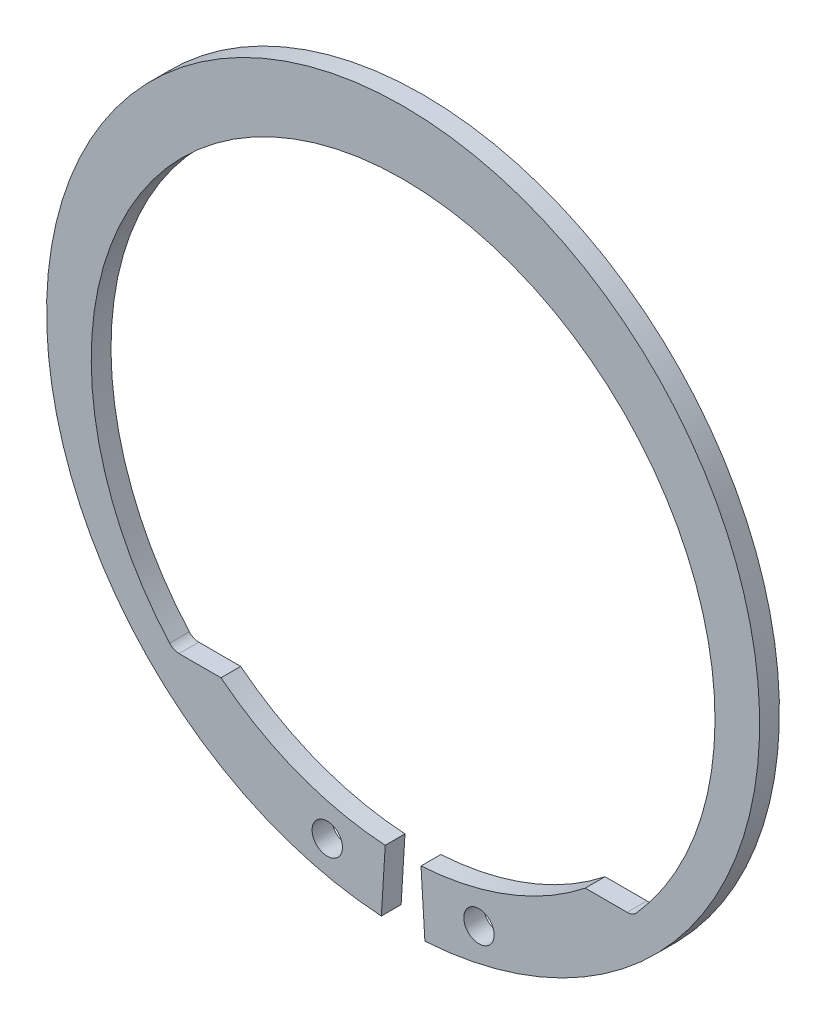
ISO-10303-21;
HEADER;
FILE_DESCRIPTION(('STEP AP214'),'2;1');
FILE_NAME('part.step','',(''),(''),'','','');
FILE_SCHEMA(('AUTOMOTIVE_DESIGN { 1 0 10303 214 1 1 1 1 }'));
ENDSEC;
DATA;
#1=APPLICATION_CONTEXT('core data for automotive mechanical design processes');
#2=APPLICATION_PROTOCOL_DEFINITION('international standard','automotive_design',2000,#1);
#3=PRODUCT_CONTEXT('',#1,'mechanical');
#4=PRODUCT('Part','Part','',(#3));
#5=PRODUCT_RELATED_PRODUCT_CATEGORY('part','',(#4));
#6=PRODUCT_DEFINITION_FORMATION('','',#4);
#7=PRODUCT_DEFINITION_CONTEXT('part definition',#1,'design');
#8=PRODUCT_DEFINITION('design','',#6,#7);
#9=PRODUCT_DEFINITION_SHAPE('','',#8);
#10=(LENGTH_UNIT() NAMED_UNIT(*) SI_UNIT(.MILLI.,.METRE.));
#11=(NAMED_UNIT(*) PLANE_ANGLE_UNIT() SI_UNIT($,.RADIAN.));
#12=(NAMED_UNIT(*) SI_UNIT($,.STERADIAN.) SOLID_ANGLE_UNIT());
#13=UNCERTAINTY_MEASURE_WITH_UNIT(LENGTH_MEASURE(1.E-05),#10,'distance_accuracy_value','');
#14=(GEOMETRIC_REPRESENTATION_CONTEXT(3) GLOBAL_UNCERTAINTY_ASSIGNED_CONTEXT((#13)) GLOBAL_UNIT_ASSIGNED_CONTEXT((#10,
#11,#12)) REPRESENTATION_CONTEXT('',''));
#15=CARTESIAN_POINT('',(0.,0.,0.));
#16=DIRECTION('',(0.,0.,1.));
#17=DIRECTION('',(1.,0.,0.));
#18=AXIS2_PLACEMENT_3D('',#15,#16,#17);
#19=CARTESIAN_POINT('',(0.,0.,0.9906));
#20=DIRECTION('',(0.,0.,1.));
#21=DIRECTION('',(1.,0.,0.));
#22=AXIS2_PLACEMENT_3D('',#19,#20,#21);
#23=PLANE('',#22);
#24=CARTESIAN_POINT('',(0.,0.,0.9906));
#25=DIRECTION('',(0.,0.,-1.));
#26=DIRECTION('',(1.,0.,0.));
#27=AXIS2_PLACEMENT_3D('',#24,#25,#26);
#28=CIRCLE('',#27,29.3751);
#29=CARTESIAN_POINT('',(-1.79330695369038,-29.3203095171222,0.9906));
#30=VERTEX_POINT('',#29);
#31=CARTESIAN_POINT('',(-18.2521778154004,-23.0163964383004,0.9906));
#32=VERTEX_POINT('',#31);
#33=EDGE_CURVE('E168',#30,#32,#28,.T.);
#34=ORIENTED_EDGE('',*,*,#33,.T.);
#35=DIRECTION('',(-1.,0.,0.));
#36=VECTOR('',#35,1.);
#37=CARTESIAN_POINT('',(-18.2521778154004,-23.0163964383004,0.9906));
#38=LINE('',#37,#36);
#39=CARTESIAN_POINT('',(-22.4515344099216,-23.0163964383004,0.9906));
#40=VERTEX_POINT('',#39);
#41=EDGE_CURVE('E170',#32,#40,#38,.T.);
#42=ORIENTED_EDGE('',*,*,#41,.T.);
#43=CARTESIAN_POINT('',(-22.4515344099216,-21.7463964383004,0.9906));
#44=DIRECTION('',(0.,0.,1.));
#45=DIRECTION('',(1.,0.,0.));
#46=AXIS2_PLACEMENT_3D('',#43,#44,#45);
#47=CIRCLE('',#46,1.27);
#48=CARTESIAN_POINT('',(-23.4025698669964,-22.5880802027788,0.9906));
#49=VERTEX_POINT('',#48);
#50=EDGE_CURVE('E11',#40,#49,#47,.F.);
#51=ORIENTED_EDGE('',*,*,#50,.T.);
#52=CARTESIAN_POINT('',(0.,-1.87637807054762,0.9906));
#53=DIRECTION('',(0.,0.,-1.));
#54=DIRECTION('',(-1.,0.,0.));
#55=AXIS2_PLACEMENT_3D('',#52,#53,#54);
#56=CIRCLE('',#55,31.2514780705476);
#57=CARTESIAN_POINT('',(23.4025698669964,-22.5880802027788,0.9906));
#58=VERTEX_POINT('',#57);
#59=EDGE_CURVE('E173',#49,#58,#56,.T.);
#60=ORIENTED_EDGE('',*,*,#59,.T.);
#61=CARTESIAN_POINT('',(22.4515344099216,-21.7463964383004,0.9906));
#62=DIRECTION('',(0.,0.,-1.));
#63=DIRECTION('',(-1.,0.,0.));
#64=AXIS2_PLACEMENT_3D('',#61,#62,#63);
#65=CIRCLE('',#64,1.27);
#66=CARTESIAN_POINT('',(22.4515344099216,-23.0163964383004,0.9906));
#67=VERTEX_POINT('',#66);
#68=EDGE_CURVE('E131',#67,#58,#65,.F.);
#69=ORIENTED_EDGE('',*,*,#68,.F.);
#70=DIRECTION('',(1.,0.,0.));
#71=VECTOR('',#70,1.);
#72=CARTESIAN_POINT('',(18.2521778154004,-23.0163964383004,0.9906));
#73=LINE('',#72,#71);
#74=CARTESIAN_POINT('',(18.2521778154004,-23.0163964383004,0.9906));
#75=VERTEX_POINT('',#74);
#76=EDGE_CURVE('E113',#75,#67,#73,.T.);
#77=ORIENTED_EDGE('',*,*,#76,.F.);
#78=CARTESIAN_POINT('',(0.,0.,0.9906));
#79=DIRECTION('',(0.,0.,1.));
#80=DIRECTION('',(-1.,0.,0.));
#81=AXIS2_PLACEMENT_3D('',#78,#79,#80);
#82=CIRCLE('',#81,29.3751);
#83=CARTESIAN_POINT('',(1.79330695369038,-29.3203095171222,0.9906));
#84=VERTEX_POINT('',#83);
#85=EDGE_CURVE('E129',#84,#75,#82,.T.);
#86=ORIENTED_EDGE('',*,*,#85,.F.);
#87=DIRECTION('',(-0.061048539534857,0.998134798421867,0.));
#88=VECTOR('',#87,1.);
#89=CARTESIAN_POINT('',(1.79330695369038,-29.3203095171222,0.9906));
#90=LINE('',#89,#88);
#91=CARTESIAN_POINT('',(2.18096517973671,-35.6584654871011,0.9906));
#92=VERTEX_POINT('',#91);
#93=EDGE_CURVE('E132',#92,#84,#90,.T.);
#94=ORIENTED_EDGE('',*,*,#93,.F.);
#95=CARTESIAN_POINT('',(0.,0.,0.9906));
#96=DIRECTION('',(0.,0.,1.));
#97=DIRECTION('',(1.,0.,0.));
#98=AXIS2_PLACEMENT_3D('',#95,#96,#97);
#99=CIRCLE('',#98,35.7251);
#100=CARTESIAN_POINT('',(-2.18096517973671,-35.6584654871011,0.9906));
#101=VERTEX_POINT('',#100);
#102=EDGE_CURVE('E175',#92,#101,#99,.T.);
#103=ORIENTED_EDGE('',*,*,#102,.T.);
#104=DIRECTION('',(0.061048539534857,0.998134798421867,0.));
#105=VECTOR('',#104,1.);
#106=CARTESIAN_POINT('',(-1.79330695369038,-29.3203095171222,0.9906));
#107=LINE('',#106,#105);
#108=EDGE_CURVE('E177',#101,#30,#107,.T.);
#109=ORIENTED_EDGE('',*,*,#108,.T.);
#110=EDGE_LOOP('',(#34,#42,#51,#60,#69,#77,#86,#94,#103,#109));
#111=FACE_BOUND('',#110,.T.);
#112=CARTESIAN_POINT('',(-7.59866993804612,-31.6507381459364,0.9906));
#113=DIRECTION('',(0.,0.,1.));
#114=DIRECTION('',(1.,0.,0.));
#115=AXIS2_PLACEMENT_3D('',#112,#113,#114);
#116=CIRCLE('',#115,1.524);
#117=CARTESIAN_POINT('',(-6.07466993804612,-31.6507381459364,0.9906));
#118=VERTEX_POINT('',#117);
#119=EDGE_CURVE('E162',#118,#118,#116,.T.);
#120=ORIENTED_EDGE('',*,*,#119,.F.);
#121=EDGE_LOOP('',(#120));
#122=FACE_BOUND('',#121,.T.);
#123=CARTESIAN_POINT('',(7.59866993804612,-31.6507381459364,0.9906));
#124=DIRECTION('',(0.,0.,-1.));
#125=DIRECTION('',(-1.,0.,0.));
#126=AXIS2_PLACEMENT_3D('',#123,#124,#125);
#127=CIRCLE('',#126,1.524);
#128=CARTESIAN_POINT('',(6.07466993804612,-31.6507381459364,0.9906));
#129=VERTEX_POINT('',#128);
#130=EDGE_CURVE('E148',#129,#129,#127,.T.);
#131=ORIENTED_EDGE('',*,*,#130,.T.);
#132=EDGE_LOOP('',(#131));
#133=FACE_BOUND('',#132,.T.);
#134=ADVANCED_FACE('F35',(#111,#122,#133),#23,.T.);
#135=CARTESIAN_POINT('',(0.,0.,-0.9906));
#136=DIRECTION('',(0.,0.,1.));
#137=DIRECTION('',(1.,0.,0.));
#138=AXIS2_PLACEMENT_3D('',#135,#136,#137);
#139=PLANE('',#138);
#140=CARTESIAN_POINT('',(0.,0.,-0.9906));
#141=DIRECTION('',(0.,0.,-1.));
#142=DIRECTION('',(1.,0.,0.));
#143=AXIS2_PLACEMENT_3D('',#140,#141,#142);
#144=CIRCLE('',#143,29.3751);
#145=CARTESIAN_POINT('',(-1.79330695369038,-29.3203095171222,-0.9906));
#146=VERTEX_POINT('',#145);
#147=CARTESIAN_POINT('',(-18.2521778154004,-23.0163964383004,-0.9906));
#148=VERTEX_POINT('',#147);
#149=EDGE_CURVE('E165',#146,#148,#144,.T.);
#150=ORIENTED_EDGE('',*,*,#149,.F.);
#151=DIRECTION('',(0.061048539534857,0.998134798421867,0.));
#152=VECTOR('',#151,1.);
#153=CARTESIAN_POINT('',(-1.79330695369038,-29.3203095171222,-0.9906));
#154=LINE('',#153,#152);
#155=CARTESIAN_POINT('',(-2.18096517973671,-35.6584654871011,-0.9906));
#156=VERTEX_POINT('',#155);
#157=EDGE_CURVE('E171',#156,#146,#154,.T.);
#158=ORIENTED_EDGE('',*,*,#157,.F.);
#159=CARTESIAN_POINT('',(0.,0.,-0.9906));
#160=DIRECTION('',(0.,0.,1.));
#161=DIRECTION('',(1.,0.,0.));
#162=AXIS2_PLACEMENT_3D('',#159,#160,#161);
#163=CIRCLE('',#162,35.7251);
#164=CARTESIAN_POINT('',(2.18096517973671,-35.6584654871011,-0.9906));
#165=VERTEX_POINT('',#164);
#166=EDGE_CURVE('E186',#165,#156,#163,.T.);
#167=ORIENTED_EDGE('',*,*,#166,.F.);
#168=DIRECTION('',(-0.061048539534857,0.998134798421867,0.));
#169=VECTOR('',#168,1.);
#170=CARTESIAN_POINT('',(1.79330695369038,-29.3203095171222,-0.9906));
#171=LINE('',#170,#169);
#172=CARTESIAN_POINT('',(1.79330695369038,-29.3203095171222,-0.9906));
#173=VERTEX_POINT('',#172);
#174=EDGE_CURVE('E137',#165,#173,#171,.T.);
#175=ORIENTED_EDGE('',*,*,#174,.T.);
#176=CARTESIAN_POINT('',(0.,0.,-0.9906));
#177=DIRECTION('',(0.,0.,1.));
#178=DIRECTION('',(-1.,0.,0.));
#179=AXIS2_PLACEMENT_3D('',#176,#177,#178);
#180=CIRCLE('',#179,29.3751);
#181=CARTESIAN_POINT('',(18.2521778154004,-23.0163964383004,-0.9906));
#182=VERTEX_POINT('',#181);
#183=EDGE_CURVE('E146',#173,#182,#180,.T.);
#184=ORIENTED_EDGE('',*,*,#183,.T.);
#185=DIRECTION('',(1.,0.,0.));
#186=VECTOR('',#185,1.);
#187=CARTESIAN_POINT('',(18.2521778154004,-23.0163964383004,-0.9906));
#188=LINE('',#187,#186);
#189=CARTESIAN_POINT('',(22.4515344099216,-23.0163964383004,-0.9906));
#190=VERTEX_POINT('',#189);
#191=EDGE_CURVE('E116',#182,#190,#188,.T.);
#192=ORIENTED_EDGE('',*,*,#191,.T.);
#193=CARTESIAN_POINT('',(22.4515344099216,-21.7463964383004,-0.9906));
#194=DIRECTION('',(0.,0.,-1.));
#195=DIRECTION('',(-1.,0.,0.));
#196=AXIS2_PLACEMENT_3D('',#193,#194,#195);
#197=CIRCLE('',#196,1.27);
#198=CARTESIAN_POINT('',(23.4025698669964,-22.5880802027788,-0.9906));
#199=VERTEX_POINT('',#198);
#200=EDGE_CURVE('E157',#199,#190,#197,.T.);
#201=ORIENTED_EDGE('',*,*,#200,.F.);
#202=CARTESIAN_POINT('',(0.,-1.87637807054762,-0.9906));
#203=DIRECTION('',(0.,0.,-1.));
#204=DIRECTION('',(-1.,0.,0.));
#205=AXIS2_PLACEMENT_3D('',#202,#203,#204);
#206=CIRCLE('',#205,31.2514780705476);
#207=CARTESIAN_POINT('',(-23.4025698669964,-22.5880802027788,-0.9906));
#208=VERTEX_POINT('',#207);
#209=EDGE_CURVE('E184',#208,#199,#206,.T.);
#210=ORIENTED_EDGE('',*,*,#209,.F.);
#211=CARTESIAN_POINT('',(-22.4515344099216,-21.7463964383004,-0.9906));
#212=DIRECTION('',(0.,0.,1.));
#213=DIRECTION('',(1.,0.,0.));
#214=AXIS2_PLACEMENT_3D('',#211,#212,#213);
#215=CIRCLE('',#214,1.27);
#216=CARTESIAN_POINT('',(-22.4515344099216,-23.0163964383004,-0.9906));
#217=VERTEX_POINT('',#216);
#218=EDGE_CURVE('E43',#208,#217,#215,.T.);
#219=ORIENTED_EDGE('',*,*,#218,.T.);
#220=DIRECTION('',(-1.,0.,0.));
#221=VECTOR('',#220,1.);
#222=CARTESIAN_POINT('',(-18.2521778154004,-23.0163964383004,-0.9906));
#223=LINE('',#222,#221);
#224=EDGE_CURVE('E182',#148,#217,#223,.T.);
#225=ORIENTED_EDGE('',*,*,#224,.F.);
#226=EDGE_LOOP('',(#150,#158,#167,#175,#184,#192,#201,#210,#219,#225));
#227=FACE_BOUND('',#226,.T.);
#228=CARTESIAN_POINT('',(-7.59866993804612,-31.6507381459364,-0.9906));
#229=DIRECTION('',(0.,0.,1.));
#230=DIRECTION('',(1.,0.,0.));
#231=AXIS2_PLACEMENT_3D('',#228,#229,#230);
#232=CIRCLE('',#231,1.524);
#233=CARTESIAN_POINT('',(-6.07466993804612,-31.6507381459364,-0.9906));
#234=VERTEX_POINT('',#233);
#235=EDGE_CURVE('E161',#234,#234,#232,.T.);
#236=ORIENTED_EDGE('',*,*,#235,.T.);
#237=EDGE_LOOP('',(#236));
#238=FACE_BOUND('',#237,.T.);
#239=CARTESIAN_POINT('',(7.59866993804612,-31.6507381459364,-0.9906));
#240=DIRECTION('',(0.,0.,-1.));
#241=DIRECTION('',(-1.,0.,0.));
#242=AXIS2_PLACEMENT_3D('',#239,#240,#241);
#243=CIRCLE('',#242,1.524);
#244=CARTESIAN_POINT('',(6.07466993804612,-31.6507381459364,-0.9906));
#245=VERTEX_POINT('',#244);
#246=EDGE_CURVE('E142',#245,#245,#243,.T.);
#247=ORIENTED_EDGE('',*,*,#246,.F.);
#248=EDGE_LOOP('',(#247));
#249=FACE_BOUND('',#248,.T.);
#250=ADVANCED_FACE('F209',(#227,#238,#249),#139,.F.);
#251=CARTESIAN_POINT('',(0.,0.,0.9906));
#252=DIRECTION('',(0.,0.,-1.));
#253=DIRECTION('',(-1.,0.,0.));
#254=AXIS2_PLACEMENT_3D('',#251,#252,#253);
#255=CYLINDRICAL_SURFACE('',#254,29.3751);
#256=ORIENTED_EDGE('',*,*,#149,.T.);
#257=DIRECTION('',(0.,0.,-1.));
#258=VECTOR('',#257,1.);
#259=CARTESIAN_POINT('',(-18.2521778154004,-23.0163964383004,0.9906));
#260=LINE('',#259,#258);
#261=EDGE_CURVE('E194',#32,#148,#260,.T.);
#262=ORIENTED_EDGE('',*,*,#261,.F.);
#263=ORIENTED_EDGE('',*,*,#33,.F.);
#264=DIRECTION('',(0.,0.,-1.));
#265=VECTOR('',#264,1.);
#266=CARTESIAN_POINT('',(-1.79330695369038,-29.3203095171222,0.9906));
#267=LINE('',#266,#265);
#268=EDGE_CURVE('E179',#30,#146,#267,.T.);
#269=ORIENTED_EDGE('',*,*,#268,.T.);
#270=EDGE_LOOP('',(#256,#262,#263,#269));
#271=FACE_BOUND('',#270,.T.);
#272=ADVANCED_FACE('F229',(#271),#255,.F.);
#273=CARTESIAN_POINT('',(-18.2521778154004,-23.0163964383004,0.9906));
#274=DIRECTION('',(0.,-1.,0.));
#275=DIRECTION('',(0.,0.,-1.));
#276=AXIS2_PLACEMENT_3D('',#273,#274,#275);
#277=PLANE('',#276);
#278=ORIENTED_EDGE('',*,*,#224,.T.);
#279=DIRECTION('',(0.,0.,1.));
#280=VECTOR('',#279,1.);
#281=CARTESIAN_POINT('',(-22.4515344099216,-23.0163964383004,0.9906));
#282=LINE('',#281,#280);
#283=EDGE_CURVE('E50',#217,#40,#282,.T.);
#284=ORIENTED_EDGE('',*,*,#283,.T.);
#285=ORIENTED_EDGE('',*,*,#41,.F.);
#286=ORIENTED_EDGE('',*,*,#261,.T.);
#287=EDGE_LOOP('',(#278,#284,#285,#286));
#288=FACE_BOUND('',#287,.T.);
#289=ADVANCED_FACE('F243',(#288),#277,.F.);
#290=CARTESIAN_POINT('',(0.,-1.87637807054762,0.9906));
#291=DIRECTION('',(0.,0.,-1.));
#292=DIRECTION('',(-1.,0.,0.));
#293=AXIS2_PLACEMENT_3D('',#290,#291,#292);
#294=CYLINDRICAL_SURFACE('',#293,31.2514780705476);
#295=ORIENTED_EDGE('',*,*,#59,.F.);
#296=DIRECTION('',(0.,0.,-1.));
#297=VECTOR('',#296,1.);
#298=CARTESIAN_POINT('',(-23.4025698669964,-22.5880802027788,0.9906));
#299=LINE('',#298,#297);
#300=EDGE_CURVE('E197',#49,#208,#299,.T.);
#301=ORIENTED_EDGE('',*,*,#300,.T.);
#302=ORIENTED_EDGE('',*,*,#209,.T.);
#303=DIRECTION('',(0.,0.,-1.));
#304=VECTOR('',#303,1.);
#305=CARTESIAN_POINT('',(23.4025698669964,-22.5880802027788,0.9906));
#306=LINE('',#305,#304);
#307=EDGE_CURVE('E121',#58,#199,#306,.T.);
#308=ORIENTED_EDGE('',*,*,#307,.F.);
#309=EDGE_LOOP('',(#295,#301,#302,#308));
#310=FACE_BOUND('',#309,.T.);
#311=ADVANCED_FACE('F203',(#310),#294,.F.);
#312=CARTESIAN_POINT('',(0.,0.,0.9906));
#313=DIRECTION('',(0.,0.,-1.));
#314=DIRECTION('',(-1.,0.,0.));
#315=AXIS2_PLACEMENT_3D('',#312,#313,#314);
#316=CYLINDRICAL_SURFACE('',#315,35.7251);
#317=ORIENTED_EDGE('',*,*,#166,.T.);
#318=DIRECTION('',(0.,0.,-1.));
#319=VECTOR('',#318,1.);
#320=CARTESIAN_POINT('',(-2.18096517973671,-35.6584654871011,0.9906));
#321=LINE('',#320,#319);
#322=EDGE_CURVE('E191',#101,#156,#321,.T.);
#323=ORIENTED_EDGE('',*,*,#322,.F.);
#324=ORIENTED_EDGE('',*,*,#102,.F.);
#325=DIRECTION('',(0.,0.,-1.));
#326=VECTOR('',#325,1.);
#327=CARTESIAN_POINT('',(2.18096517973671,-35.6584654871011,0.9906));
#328=LINE('',#327,#326);
#329=EDGE_CURVE('E122',#92,#165,#328,.T.);
#330=ORIENTED_EDGE('',*,*,#329,.T.);
#331=EDGE_LOOP('',(#317,#323,#324,#330));
#332=FACE_BOUND('',#331,.T.);
#333=ADVANCED_FACE('F236',(#332),#316,.T.);
#334=CARTESIAN_POINT('',(-1.79330695369038,-29.3203095171222,0.9906));
#335=DIRECTION('',(-0.998134798421867,0.061048539534857,0.));
#336=DIRECTION('',(-0.061048539534857,-0.998134798421867,0.));
#337=AXIS2_PLACEMENT_3D('',#334,#335,#336);
#338=PLANE('',#337);
#339=ORIENTED_EDGE('',*,*,#157,.T.);
#340=ORIENTED_EDGE('',*,*,#268,.F.);
#341=ORIENTED_EDGE('',*,*,#108,.F.);
#342=ORIENTED_EDGE('',*,*,#322,.T.);
#343=EDGE_LOOP('',(#339,#340,#341,#342));
#344=FACE_BOUND('',#343,.T.);
#345=ADVANCED_FACE('F233',(#344),#338,.F.);
#346=CARTESIAN_POINT('',(-7.59866993804612,-31.6507381459364,0.9906));
#347=DIRECTION('',(0.,0.,-1.));
#348=DIRECTION('',(-1.,0.,0.));
#349=AXIS2_PLACEMENT_3D('',#346,#347,#348);
#350=CYLINDRICAL_SURFACE('',#349,1.524);
#351=ORIENTED_EDGE('',*,*,#119,.T.);
#352=EDGE_LOOP('',(#351));
#353=FACE_BOUND('',#352,.T.);
#354=ORIENTED_EDGE('',*,*,#235,.F.);
#355=EDGE_LOOP('',(#354));
#356=FACE_BOUND('',#355,.T.);
#357=ADVANCED_FACE('F231',(#353,#356),#350,.F.);
#358=CARTESIAN_POINT('',(-22.4515344099216,-21.7463964383004,0.9906));
#359=DIRECTION('',(0.,0.,-1.));
#360=DIRECTION('',(-1.,0.,0.));
#361=AXIS2_PLACEMENT_3D('',#358,#359,#360);
#362=CYLINDRICAL_SURFACE('',#361,1.27);
#363=ORIENTED_EDGE('',*,*,#50,.F.);
#364=ORIENTED_EDGE('',*,*,#283,.F.);
#365=ORIENTED_EDGE('',*,*,#218,.F.);
#366=ORIENTED_EDGE('',*,*,#300,.F.);
#367=EDGE_LOOP('',(#363,#364,#365,#366));
#368=FACE_BOUND('',#367,.T.);
#369=ADVANCED_FACE('F37',(#368),#362,.F.);
#370=CARTESIAN_POINT('',(0.,0.,0.9906));
#371=DIRECTION('',(0.,0.,-1.));
#372=DIRECTION('',(1.,0.,0.));
#373=AXIS2_PLACEMENT_3D('',#370,#371,#372);
#374=CYLINDRICAL_SURFACE('',#373,29.3751);
#375=ORIENTED_EDGE('',*,*,#183,.F.);
#376=DIRECTION('',(0.,0.,-1.));
#377=VECTOR('',#376,1.);
#378=CARTESIAN_POINT('',(1.79330695369038,-29.3203095171222,0.9906));
#379=LINE('',#378,#377);
#380=EDGE_CURVE('E135',#84,#173,#379,.T.);
#381=ORIENTED_EDGE('',*,*,#380,.F.);
#382=ORIENTED_EDGE('',*,*,#85,.T.);
#383=DIRECTION('',(0.,0.,-1.));
#384=VECTOR('',#383,1.);
#385=CARTESIAN_POINT('',(18.2521778154004,-23.0163964383004,0.9906));
#386=LINE('',#385,#384);
#387=EDGE_CURVE('E110',#75,#182,#386,.T.);
#388=ORIENTED_EDGE('',*,*,#387,.T.);
#389=EDGE_LOOP('',(#375,#381,#382,#388));
#390=FACE_BOUND('',#389,.T.);
#391=ADVANCED_FACE('F134',(#390),#374,.F.);
#392=CARTESIAN_POINT('',(18.2521778154004,-23.0163964383004,0.9906));
#393=DIRECTION('',(0.,-1.,0.));
#394=DIRECTION('',(0.,0.,-1.));
#395=AXIS2_PLACEMENT_3D('',#392,#393,#394);
#396=PLANE('',#395);
#397=ORIENTED_EDGE('',*,*,#191,.F.);
#398=ORIENTED_EDGE('',*,*,#387,.F.);
#399=ORIENTED_EDGE('',*,*,#76,.T.);
#400=DIRECTION('',(0.,0.,1.));
#401=VECTOR('',#400,1.);
#402=CARTESIAN_POINT('',(22.4515344099216,-23.0163964383004,0.9906));
#403=LINE('',#402,#401);
#404=EDGE_CURVE('E155',#190,#67,#403,.T.);
#405=ORIENTED_EDGE('',*,*,#404,.F.);
#406=EDGE_LOOP('',(#397,#398,#399,#405));
#407=FACE_BOUND('',#406,.T.);
#408=ADVANCED_FACE('F112',(#407),#396,.F.);
#409=CARTESIAN_POINT('',(1.79330695369038,-29.3203095171222,0.9906));
#410=DIRECTION('',(0.998134798421867,0.061048539534857,0.));
#411=DIRECTION('',(0.061048539534857,-0.998134798421867,0.));
#412=AXIS2_PLACEMENT_3D('',#409,#410,#411);
#413=PLANE('',#412);
#414=ORIENTED_EDGE('',*,*,#174,.F.);
#415=ORIENTED_EDGE('',*,*,#329,.F.);
#416=ORIENTED_EDGE('',*,*,#93,.T.);
#417=ORIENTED_EDGE('',*,*,#380,.T.);
#418=EDGE_LOOP('',(#414,#415,#416,#417));
#419=FACE_BOUND('',#418,.T.);
#420=ADVANCED_FACE('F219',(#419),#413,.F.);
#421=CARTESIAN_POINT('',(7.59866993804612,-31.6507381459364,0.9906));
#422=DIRECTION('',(0.,0.,-1.));
#423=DIRECTION('',(1.,0.,0.));
#424=AXIS2_PLACEMENT_3D('',#421,#422,#423);
#425=CYLINDRICAL_SURFACE('',#424,1.524);
#426=ORIENTED_EDGE('',*,*,#130,.F.);
#427=EDGE_LOOP('',(#426));
#428=FACE_BOUND('',#427,.T.);
#429=ORIENTED_EDGE('',*,*,#246,.T.);
#430=EDGE_LOOP('',(#429));
#431=FACE_BOUND('',#430,.T.);
#432=ADVANCED_FACE('F214',(#428,#431),#425,.F.);
#433=CARTESIAN_POINT('',(22.4515344099216,-21.7463964383004,0.9906));
#434=DIRECTION('',(0.,0.,-1.));
#435=DIRECTION('',(1.,0.,0.));
#436=AXIS2_PLACEMENT_3D('',#433,#434,#435);
#437=CYLINDRICAL_SURFACE('',#436,1.27);
#438=ORIENTED_EDGE('',*,*,#68,.T.);
#439=ORIENTED_EDGE('',*,*,#307,.T.);
#440=ORIENTED_EDGE('',*,*,#200,.T.);
#441=ORIENTED_EDGE('',*,*,#404,.T.);
#442=EDGE_LOOP('',(#438,#439,#440,#441));
#443=FACE_BOUND('',#442,.T.);
#444=ADVANCED_FACE('F212',(#443),#437,.F.);
#445=CLOSED_SHELL('',(#134,#250,#272,#289,#311,#333,#345,#357,#369,#391,#408,#420,#432,#444));
#446=MANIFOLD_SOLID_BREP('B2',#445);
#447=ADVANCED_BREP_SHAPE_REPRESENTATION('',(#18,#446),#14);
#448=SHAPE_DEFINITION_REPRESENTATION(#9,#447);
ENDSEC;
END-ISO-10303-21;
